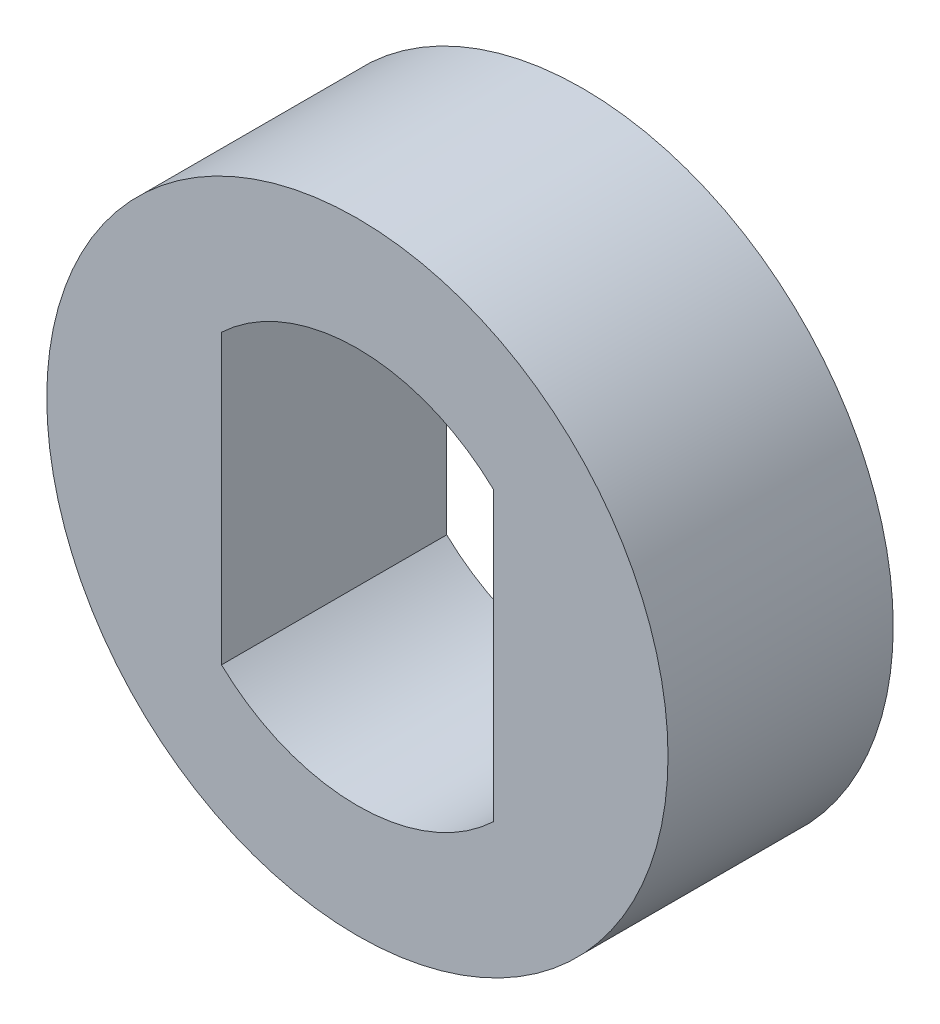
ISO-10303-21;
HEADER;
FILE_DESCRIPTION(('STEP AP214'),'2;1');
FILE_NAME('part.step','',(''),(''),'','','');
FILE_SCHEMA(('AUTOMOTIVE_DESIGN { 1 0 10303 214 1 1 1 1 }'));
ENDSEC;
DATA;
#1=APPLICATION_CONTEXT('core data for automotive mechanical design processes');
#2=APPLICATION_PROTOCOL_DEFINITION('international standard','automotive_design',2000,#1);
#3=PRODUCT_CONTEXT('',#1,'mechanical');
#4=PRODUCT('Part','Part','',(#3));
#5=PRODUCT_RELATED_PRODUCT_CATEGORY('part','',(#4));
#6=PRODUCT_DEFINITION_FORMATION('','',#4);
#7=PRODUCT_DEFINITION_CONTEXT('part definition',#1,'design');
#8=PRODUCT_DEFINITION('design','',#6,#7);
#9=PRODUCT_DEFINITION_SHAPE('','',#8);
#10=(LENGTH_UNIT() NAMED_UNIT(*) SI_UNIT(.MILLI.,.METRE.));
#11=(NAMED_UNIT(*) PLANE_ANGLE_UNIT() SI_UNIT($,.RADIAN.));
#12=(NAMED_UNIT(*) SI_UNIT($,.STERADIAN.) SOLID_ANGLE_UNIT());
#13=UNCERTAINTY_MEASURE_WITH_UNIT(LENGTH_MEASURE(1.E-05),#10,'distance_accuracy_value','');
#14=(GEOMETRIC_REPRESENTATION_CONTEXT(3) GLOBAL_UNCERTAINTY_ASSIGNED_CONTEXT((#13)) GLOBAL_UNIT_ASSIGNED_CONTEXT((#10,
#11,#12)) REPRESENTATION_CONTEXT('',''));
#15=CARTESIAN_POINT('',(0.,0.,0.));
#16=DIRECTION('',(0.,0.,1.));
#17=DIRECTION('',(1.,0.,0.));
#18=AXIS2_PLACEMENT_3D('',#15,#16,#17);
#19=CARTESIAN_POINT('',(0.,0.,1.45));
#20=DIRECTION('',(0.,0.,1.));
#21=DIRECTION('',(1.,0.,0.));
#22=AXIS2_PLACEMENT_3D('',#19,#20,#21);
#23=PLANE('',#22);
#24=CARTESIAN_POINT('',(0.,0.,1.45));
#25=DIRECTION('',(0.,0.,1.));
#26=DIRECTION('',(1.,0.,0.));
#27=AXIS2_PLACEMENT_3D('',#24,#25,#26);
#28=CIRCLE('',#27,4.);
#29=CARTESIAN_POINT('',(4.,0.,1.45));
#30=VERTEX_POINT('',#29);
#31=EDGE_CURVE('E11',#30,#30,#28,.T.);
#32=ORIENTED_EDGE('',*,*,#31,.T.);
#33=EDGE_LOOP('',(#32));
#34=FACE_BOUND('',#33,.T.);
#35=DIRECTION('',(0.,-1.,0.));
#36=VECTOR('',#35,1.);
#37=CARTESIAN_POINT('',(-1.75,-1.85472369909914,1.45));
#38=LINE('',#37,#36);
#39=CARTESIAN_POINT('',(-1.75,1.85472369909914,1.45));
#40=VERTEX_POINT('',#39);
#41=CARTESIAN_POINT('',(-1.75,-1.85472369909914,1.45));
#42=VERTEX_POINT('',#41);
#43=EDGE_CURVE('E90',#40,#42,#38,.T.);
#44=ORIENTED_EDGE('',*,*,#43,.F.);
#45=CARTESIAN_POINT('',(0.,0.,1.45));
#46=DIRECTION('',(0.,0.,1.));
#47=DIRECTION('',(1.,0.,0.));
#48=AXIS2_PLACEMENT_3D('',#45,#46,#47);
#49=CIRCLE('',#48,2.55);
#50=CARTESIAN_POINT('',(1.75,1.85472369909914,1.45));
#51=VERTEX_POINT('',#50);
#52=EDGE_CURVE('E81',#51,#40,#49,.T.);
#53=ORIENTED_EDGE('',*,*,#52,.F.);
#54=DIRECTION('',(0.,1.,0.));
#55=VECTOR('',#54,1.);
#56=CARTESIAN_POINT('',(1.75,-1.85472369909914,1.45));
#57=LINE('',#56,#55);
#58=CARTESIAN_POINT('',(1.75,-1.85472369909914,1.45));
#59=VERTEX_POINT('',#58);
#60=EDGE_CURVE('E106',#59,#51,#57,.T.);
#61=ORIENTED_EDGE('',*,*,#60,.F.);
#62=CARTESIAN_POINT('',(0.,0.,1.45));
#63=DIRECTION('',(0.,0.,1.));
#64=DIRECTION('',(1.,0.,0.));
#65=AXIS2_PLACEMENT_3D('',#62,#63,#64);
#66=CIRCLE('',#65,2.55);
#67=EDGE_CURVE('E102',#42,#59,#66,.T.);
#68=ORIENTED_EDGE('',*,*,#67,.F.);
#69=EDGE_LOOP('',(#44,#53,#61,#68));
#70=FACE_BOUND('',#69,.T.);
#71=ADVANCED_FACE('F39',(#34,#70),#23,.T.);
#72=CARTESIAN_POINT('',(0.,0.,-1.45));
#73=DIRECTION('',(0.,0.,1.));
#74=DIRECTION('',(1.,0.,0.));
#75=AXIS2_PLACEMENT_3D('',#72,#73,#74);
#76=PLANE('',#75);
#77=CARTESIAN_POINT('',(0.,0.,-1.45));
#78=DIRECTION('',(0.,0.,1.));
#79=DIRECTION('',(1.,0.,0.));
#80=AXIS2_PLACEMENT_3D('',#77,#78,#79);
#81=CIRCLE('',#80,4.);
#82=CARTESIAN_POINT('',(4.,0.,-1.45));
#83=VERTEX_POINT('',#82);
#84=EDGE_CURVE('E43',#83,#83,#81,.T.);
#85=ORIENTED_EDGE('',*,*,#84,.F.);
#86=EDGE_LOOP('',(#85));
#87=FACE_BOUND('',#86,.T.);
#88=CARTESIAN_POINT('',(0.,0.,-1.45));
#89=DIRECTION('',(0.,0.,1.));
#90=DIRECTION('',(1.,0.,0.));
#91=AXIS2_PLACEMENT_3D('',#88,#89,#90);
#92=CIRCLE('',#91,2.55);
#93=CARTESIAN_POINT('',(1.75,1.85472369909914,-1.45));
#94=VERTEX_POINT('',#93);
#95=CARTESIAN_POINT('',(-1.75,1.85472369909914,-1.45));
#96=VERTEX_POINT('',#95);
#97=EDGE_CURVE('E63',#94,#96,#92,.T.);
#98=ORIENTED_EDGE('',*,*,#97,.T.);
#99=DIRECTION('',(0.,-1.,0.));
#100=VECTOR('',#99,1.);
#101=CARTESIAN_POINT('',(-1.75,-1.85472369909914,-1.45));
#102=LINE('',#101,#100);
#103=CARTESIAN_POINT('',(-1.75,-1.85472369909914,-1.45));
#104=VERTEX_POINT('',#103);
#105=EDGE_CURVE('E97',#96,#104,#102,.T.);
#106=ORIENTED_EDGE('',*,*,#105,.T.);
#107=CARTESIAN_POINT('',(0.,0.,-1.45));
#108=DIRECTION('',(0.,0.,1.));
#109=DIRECTION('',(1.,0.,0.));
#110=AXIS2_PLACEMENT_3D('',#107,#108,#109);
#111=CIRCLE('',#110,2.55);
#112=CARTESIAN_POINT('',(1.75,-1.85472369909914,-1.45));
#113=VERTEX_POINT('',#112);
#114=EDGE_CURVE('E115',#104,#113,#111,.T.);
#115=ORIENTED_EDGE('',*,*,#114,.T.);
#116=DIRECTION('',(0.,1.,0.));
#117=VECTOR('',#116,1.);
#118=CARTESIAN_POINT('',(1.75,-1.85472369909914,-1.45));
#119=LINE('',#118,#117);
#120=EDGE_CURVE('E91',#113,#94,#119,.T.);
#121=ORIENTED_EDGE('',*,*,#120,.T.);
#122=EDGE_LOOP('',(#98,#106,#115,#121));
#123=FACE_BOUND('',#122,.T.);
#124=ADVANCED_FACE('F131',(#87,#123),#76,.F.);
#125=CARTESIAN_POINT('',(0.,0.,1.45));
#126=DIRECTION('',(0.,0.,-1.));
#127=DIRECTION('',(-1.,0.,0.));
#128=AXIS2_PLACEMENT_3D('',#125,#126,#127);
#129=CYLINDRICAL_SURFACE('',#128,4.);
#130=ORIENTED_EDGE('',*,*,#31,.F.);
#131=EDGE_LOOP('',(#130));
#132=FACE_BOUND('',#131,.T.);
#133=ORIENTED_EDGE('',*,*,#84,.T.);
#134=EDGE_LOOP('',(#133));
#135=FACE_BOUND('',#134,.T.);
#136=ADVANCED_FACE('F41',(#132,#135),#129,.T.);
#137=CARTESIAN_POINT('',(0.,0.,1.45));
#138=DIRECTION('',(0.,0.,-1.));
#139=DIRECTION('',(-1.,0.,0.));
#140=AXIS2_PLACEMENT_3D('',#137,#138,#139);
#141=CYLINDRICAL_SURFACE('',#140,2.55);
#142=ORIENTED_EDGE('',*,*,#97,.F.);
#143=DIRECTION('',(0.,0.,-1.));
#144=VECTOR('',#143,1.);
#145=CARTESIAN_POINT('',(1.75,1.85472369909914,1.45));
#146=LINE('',#145,#144);
#147=EDGE_CURVE('E85',#51,#94,#146,.T.);
#148=ORIENTED_EDGE('',*,*,#147,.F.);
#149=ORIENTED_EDGE('',*,*,#52,.T.);
#150=DIRECTION('',(0.,0.,-1.));
#151=VECTOR('',#150,1.);
#152=CARTESIAN_POINT('',(-1.75,1.85472369909914,1.45));
#153=LINE('',#152,#151);
#154=EDGE_CURVE('E84',#40,#96,#153,.T.);
#155=ORIENTED_EDGE('',*,*,#154,.T.);
#156=EDGE_LOOP('',(#142,#148,#149,#155));
#157=FACE_BOUND('',#156,.T.);
#158=ADVANCED_FACE('F83',(#157),#141,.F.);
#159=CARTESIAN_POINT('',(-1.75,-1.85472369909914,1.45));
#160=DIRECTION('',(1.,0.,0.));
#161=DIRECTION('',(0.,0.,-1.));
#162=AXIS2_PLACEMENT_3D('',#159,#160,#161);
#163=PLANE('',#162);
#164=ORIENTED_EDGE('',*,*,#105,.F.);
#165=ORIENTED_EDGE('',*,*,#154,.F.);
#166=ORIENTED_EDGE('',*,*,#43,.T.);
#167=DIRECTION('',(0.,0.,-1.));
#168=VECTOR('',#167,1.);
#169=CARTESIAN_POINT('',(-1.75,-1.85472369909914,1.45));
#170=LINE('',#169,#168);
#171=EDGE_CURVE('E99',#42,#104,#170,.T.);
#172=ORIENTED_EDGE('',*,*,#171,.T.);
#173=EDGE_LOOP('',(#164,#165,#166,#172));
#174=FACE_BOUND('',#173,.T.);
#175=ADVANCED_FACE('F94',(#174),#163,.T.);
#176=CARTESIAN_POINT('',(0.,0.,1.45));
#177=DIRECTION('',(0.,0.,-1.));
#178=DIRECTION('',(-1.,0.,0.));
#179=AXIS2_PLACEMENT_3D('',#176,#177,#178);
#180=CYLINDRICAL_SURFACE('',#179,2.55);
#181=ORIENTED_EDGE('',*,*,#114,.F.);
#182=ORIENTED_EDGE('',*,*,#171,.F.);
#183=ORIENTED_EDGE('',*,*,#67,.T.);
#184=DIRECTION('',(0.,0.,-1.));
#185=VECTOR('',#184,1.);
#186=CARTESIAN_POINT('',(1.75,-1.85472369909914,1.45));
#187=LINE('',#186,#185);
#188=EDGE_CURVE('E55',#59,#113,#187,.T.);
#189=ORIENTED_EDGE('',*,*,#188,.T.);
#190=EDGE_LOOP('',(#181,#182,#183,#189));
#191=FACE_BOUND('',#190,.T.);
#192=ADVANCED_FACE('F129',(#191),#180,.F.);
#193=CARTESIAN_POINT('',(1.75,-1.85472369909914,1.45));
#194=DIRECTION('',(-1.,0.,0.));
#195=DIRECTION('',(0.,0.,1.));
#196=AXIS2_PLACEMENT_3D('',#193,#194,#195);
#197=PLANE('',#196);
#198=ORIENTED_EDGE('',*,*,#120,.F.);
#199=ORIENTED_EDGE('',*,*,#188,.F.);
#200=ORIENTED_EDGE('',*,*,#60,.T.);
#201=ORIENTED_EDGE('',*,*,#147,.T.);
#202=EDGE_LOOP('',(#198,#199,#200,#201));
#203=FACE_BOUND('',#202,.T.);
#204=ADVANCED_FACE('F132',(#203),#197,.T.);
#205=CLOSED_SHELL('',(#71,#124,#136,#158,#175,#192,#204));
#206=MANIFOLD_SOLID_BREP('B2',#205);
#207=ADVANCED_BREP_SHAPE_REPRESENTATION('',(#18,#206),#14);
#208=SHAPE_DEFINITION_REPRESENTATION(#9,#207);
ENDSEC;
END-ISO-10303-21;
